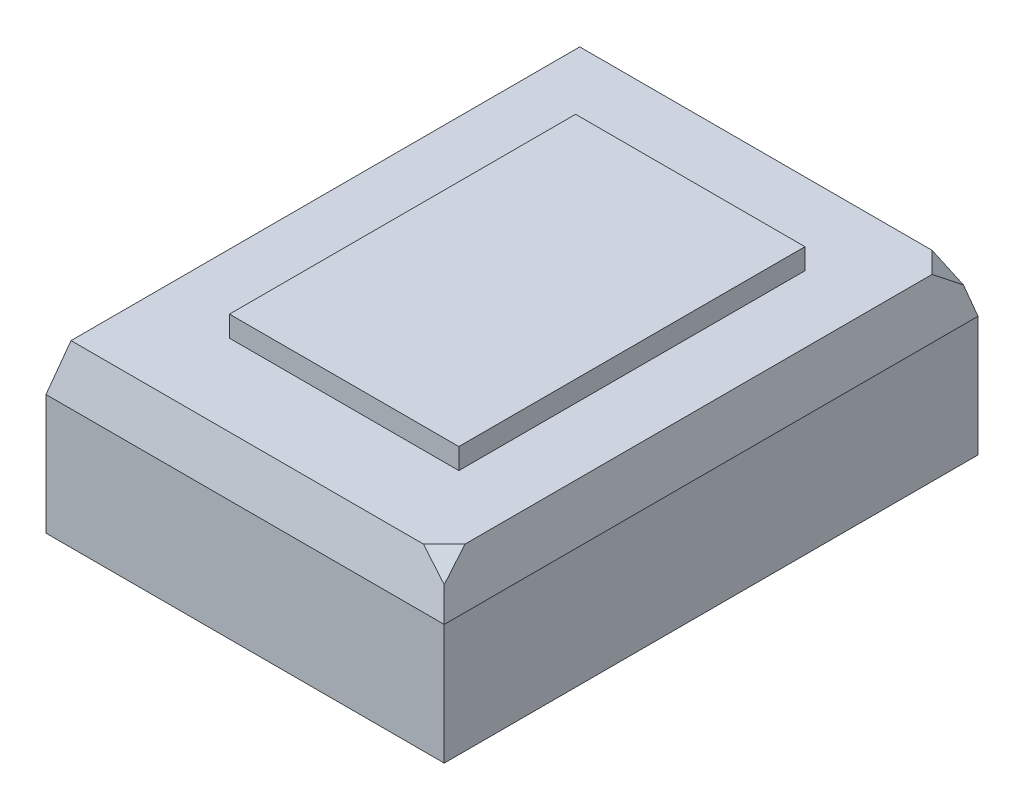
ISO-10303-21;
HEADER;
FILE_DESCRIPTION(('STEP AP214'),'2;1');
FILE_NAME('part.step','',(''),(''),'','','');
FILE_SCHEMA(('AUTOMOTIVE_DESIGN { 1 0 10303 214 1 1 1 1 }'));
ENDSEC;
DATA;
#1=APPLICATION_CONTEXT('core data for automotive mechanical design processes');
#2=APPLICATION_PROTOCOL_DEFINITION('international standard','automotive_design',2000,#1);
#3=PRODUCT_CONTEXT('',#1,'mechanical');
#4=PRODUCT('Part','Part','',(#3));
#5=PRODUCT_RELATED_PRODUCT_CATEGORY('part','',(#4));
#6=PRODUCT_DEFINITION_FORMATION('','',#4);
#7=PRODUCT_DEFINITION_CONTEXT('part definition',#1,'design');
#8=PRODUCT_DEFINITION('design','',#6,#7);
#9=PRODUCT_DEFINITION_SHAPE('','',#8);
#10=(LENGTH_UNIT() NAMED_UNIT(*) SI_UNIT(.MILLI.,.METRE.));
#11=(NAMED_UNIT(*) PLANE_ANGLE_UNIT() SI_UNIT($,.RADIAN.));
#12=(NAMED_UNIT(*) SI_UNIT($,.STERADIAN.) SOLID_ANGLE_UNIT());
#13=UNCERTAINTY_MEASURE_WITH_UNIT(LENGTH_MEASURE(1.E-05),#10,'distance_accuracy_value','');
#14=(GEOMETRIC_REPRESENTATION_CONTEXT(3) GLOBAL_UNCERTAINTY_ASSIGNED_CONTEXT((#13)) GLOBAL_UNIT_ASSIGNED_CONTEXT((#10,
#11,#12)) REPRESENTATION_CONTEXT('',''));
#15=CARTESIAN_POINT('',(0.,0.,0.));
#16=DIRECTION('',(0.,0.,1.));
#17=DIRECTION('',(1.,0.,0.));
#18=AXIS2_PLACEMENT_3D('',#15,#16,#17);
#19=CARTESIAN_POINT('',(47.75,28.8038475772934,0.));
#20=DIRECTION('',(-0.965925826289068,-0.258819045102523,0.));
#21=DIRECTION('',(0.,0.,1.));
#22=AXIS2_PLACEMENT_3D('',#19,#20,#21);
#23=PLANE('',#22);
#24=DIRECTION('',(0.158434170327627,-0.591284373317722,0.790747370240879));
#25=VECTOR('',#24,1.);
#26=CARTESIAN_POINT('',(38.8583971909708,61.9877610213121,26.5949201607857));
#27=LINE('',#26,#25);
#28=CARTESIAN_POINT('',(46.0028140354287,35.3244343673448,62.2528140354287));
#29=VERTEX_POINT('',#28);
#30=CARTESIAN_POINT('',(44.75,40.,56.));
#31=VERTEX_POINT('',#30);
#32=EDGE_CURVE('E144',#29,#31,#27,.F.);
#33=ORIENTED_EDGE('',*,*,#32,.F.);
#34=DIRECTION('',(-0.250562807085733,0.935113126531028,-0.250562807085733));
#35=VECTOR('',#34,1.);
#36=CARTESIAN_POINT('',(43.7319699011403,43.7993400525786,59.9819699011403));
#37=LINE('',#36,#35);
#38=CARTESIAN_POINT('',(47.75,28.8038475772934,64.));
#39=VERTEX_POINT('',#38);
#40=EDGE_CURVE('E134',#39,#29,#37,.T.);
#41=ORIENTED_EDGE('',*,*,#40,.F.);
#42=DIRECTION('',(0.,0.,1.));
#43=VECTOR('',#42,1.);
#44=CARTESIAN_POINT('',(47.75,28.8038475772934,0.));
#45=LINE('',#44,#43);
#46=CARTESIAN_POINT('',(47.75,28.8038475772934,-64.));
#47=VERTEX_POINT('',#46);
#48=EDGE_CURVE('E169',#47,#39,#45,.T.);
#49=ORIENTED_EDGE('',*,*,#48,.F.);
#50=DIRECTION('',(0.250562807085733,-0.935113126531028,-0.250562807085733));
#51=VECTOR('',#50,1.);
#52=CARTESIAN_POINT('',(44.7521728559289,39.9918907912757,-61.0021728559289));
#53=LINE('',#52,#51);
#54=CARTESIAN_POINT('',(46.0028140354286,35.3244343673449,-62.2528140354286));
#55=VERTEX_POINT('',#54);
#56=EDGE_CURVE('E164',#47,#55,#53,.F.);
#57=ORIENTED_EDGE('',*,*,#56,.T.);
#58=DIRECTION('',(0.158434170327627,-0.591284373317722,-0.790747370240879));
#59=VECTOR('',#58,1.);
#60=CARTESIAN_POINT('',(38.8583971909708,61.9877610213121,-26.5949201607857));
#61=LINE('',#60,#59);
#62=CARTESIAN_POINT('',(44.75,40.,-56.));
#63=VERTEX_POINT('',#62);
#64=EDGE_CURVE('E148',#55,#63,#61,.F.);
#65=ORIENTED_EDGE('',*,*,#64,.T.);
#66=DIRECTION('',(0.,0.,-1.));
#67=VECTOR('',#66,1.);
#68=CARTESIAN_POINT('',(44.75,40.,0.));
#69=LINE('',#68,#67);
#70=EDGE_CURVE('E146',#31,#63,#69,.T.);
#71=ORIENTED_EDGE('',*,*,#70,.F.);
#72=EDGE_LOOP('',(#33,#41,#49,#57,#65,#71));
#73=FACE_BOUND('',#72,.T.);
#74=ADVANCED_FACE('F47',(#73),#23,.F.);
#75=CARTESIAN_POINT('',(0.,28.8038475772934,-64.));
#76=DIRECTION('',(0.,-0.258819045102523,0.965925826289068));
#77=DIRECTION('',(1.,0.,0.));
#78=AXIS2_PLACEMENT_3D('',#75,#76,#77);
#79=PLANE('',#78);
#80=DIRECTION('',(-1.,0.,0.));
#81=VECTOR('',#80,1.);
#82=CARTESIAN_POINT('',(0.,40.,-61.));
#83=LINE('',#82,#81);
#84=CARTESIAN_POINT('',(39.75,40.,-61.));
#85=VERTEX_POINT('',#84);
#86=CARTESIAN_POINT('',(-44.75,40.,-61.));
#87=VERTEX_POINT('',#86);
#88=EDGE_CURVE('E179',#85,#87,#83,.T.);
#89=ORIENTED_EDGE('',*,*,#88,.F.);
#90=DIRECTION('',(-0.790747370240879,0.591284373317722,0.158434170327627));
#91=VECTOR('',#90,1.);
#92=CARTESIAN_POINT('',(20.5057429683572,54.3899668682474,-57.1442199985424));
#93=LINE('',#92,#91);
#94=EDGE_CURVE('E153',#85,#55,#93,.F.);
#95=ORIENTED_EDGE('',*,*,#94,.T.);
#96=ORIENTED_EDGE('',*,*,#56,.F.);
#97=DIRECTION('',(1.,0.,0.));
#98=VECTOR('',#97,1.);
#99=CARTESIAN_POINT('',(0.,28.8038475772934,-64.));
#100=LINE('',#99,#98);
#101=CARTESIAN_POINT('',(-47.75,28.8038475772934,-64.));
#102=VERTEX_POINT('',#101);
#103=EDGE_CURVE('E159',#102,#47,#100,.T.);
#104=ORIENTED_EDGE('',*,*,#103,.F.);
#105=DIRECTION('',(-0.250562807085733,-0.935113126531028,-0.250562807085733));
#106=VECTOR('',#105,1.);
#107=CARTESIAN_POINT('',(-44.7521728559289,39.9918907912757,-61.0021728559289));
#108=LINE('',#107,#106);
#109=EDGE_CURVE('E160',#87,#102,#108,.T.);
#110=ORIENTED_EDGE('',*,*,#109,.F.);
#111=EDGE_LOOP('',(#89,#95,#96,#104,#110));
#112=FACE_BOUND('',#111,.T.);
#113=ADVANCED_FACE('F50',(#112),#79,.F.);
#114=CARTESIAN_POINT('',(0.,40.,0.));
#115=DIRECTION('',(0.,1.,0.));
#116=DIRECTION('',(0.,0.,1.));
#117=AXIS2_PLACEMENT_3D('',#114,#115,#116);
#118=PLANE('',#117);
#119=DIRECTION('',(-0.707106781186548,0.,0.707106781186548));
#120=VECTOR('',#119,1.);
#121=CARTESIAN_POINT('',(50.375,40.,50.375));
#122=LINE('',#121,#120);
#123=CARTESIAN_POINT('',(39.75,40.,61.));
#124=VERTEX_POINT('',#123);
#125=EDGE_CURVE('E56',#31,#124,#122,.T.);
#126=ORIENTED_EDGE('',*,*,#125,.F.);
#127=ORIENTED_EDGE('',*,*,#70,.T.);
#128=DIRECTION('',(-0.707106781186548,0.,-0.707106781186548));
#129=VECTOR('',#128,1.);
#130=CARTESIAN_POINT('',(50.375,40.,-50.375));
#131=LINE('',#130,#129);
#132=EDGE_CURVE('E156',#63,#85,#131,.T.);
#133=ORIENTED_EDGE('',*,*,#132,.T.);
#134=ORIENTED_EDGE('',*,*,#88,.T.);
#135=DIRECTION('',(0.,0.,1.));
#136=VECTOR('',#135,1.);
#137=CARTESIAN_POINT('',(-44.75,40.,64.));
#138=LINE('',#137,#136);
#139=CARTESIAN_POINT('',(-44.75,40.,61.));
#140=VERTEX_POINT('',#139);
#141=EDGE_CURVE('E176',#87,#140,#138,.T.);
#142=ORIENTED_EDGE('',*,*,#141,.T.);
#143=DIRECTION('',(1.,0.,0.));
#144=VECTOR('',#143,1.);
#145=CARTESIAN_POINT('',(47.75,40.,61.));
#146=LINE('',#145,#144);
#147=EDGE_CURVE('E174',#140,#124,#146,.T.);
#148=ORIENTED_EDGE('',*,*,#147,.T.);
#149=EDGE_LOOP('',(#126,#127,#133,#134,#142,#148));
#150=FACE_BOUND('',#149,.T.);
#151=DIRECTION('',(0.,0.,-1.));
#152=VECTOR('',#151,1.);
#153=CARTESIAN_POINT('',(28.75,40.,0.));
#154=LINE('',#153,#152);
#155=CARTESIAN_POINT('',(28.75,40.,41.5));
#156=VERTEX_POINT('',#155);
#157=CARTESIAN_POINT('',(28.75,40.,-41.5));
#158=VERTEX_POINT('',#157);
#159=EDGE_CURVE('E214',#156,#158,#154,.T.);
#160=ORIENTED_EDGE('',*,*,#159,.F.);
#161=DIRECTION('',(-1.,0.,0.));
#162=VECTOR('',#161,1.);
#163=CARTESIAN_POINT('',(0.,40.,41.5));
#164=LINE('',#163,#162);
#165=CARTESIAN_POINT('',(-26.25,40.,41.5));
#166=VERTEX_POINT('',#165);
#167=EDGE_CURVE('E163',#156,#166,#164,.T.);
#168=ORIENTED_EDGE('',*,*,#167,.T.);
#169=DIRECTION('',(0.,0.,-1.));
#170=VECTOR('',#169,1.);
#171=CARTESIAN_POINT('',(-26.25,40.,0.));
#172=LINE('',#171,#170);
#173=CARTESIAN_POINT('',(-26.25,40.,-41.5));
#174=VERTEX_POINT('',#173);
#175=EDGE_CURVE('E221',#166,#174,#172,.T.);
#176=ORIENTED_EDGE('',*,*,#175,.T.);
#177=DIRECTION('',(-1.,0.,0.));
#178=VECTOR('',#177,1.);
#179=CARTESIAN_POINT('',(0.,40.,-41.5));
#180=LINE('',#179,#178);
#181=EDGE_CURVE('E218',#158,#174,#180,.T.);
#182=ORIENTED_EDGE('',*,*,#181,.F.);
#183=EDGE_LOOP('',(#160,#168,#176,#182));
#184=FACE_BOUND('',#183,.T.);
#185=ADVANCED_FACE('F246',(#150,#184),#118,.T.);
#186=CARTESIAN_POINT('',(47.75,40.,0.));
#187=DIRECTION('',(1.,0.,0.));
#188=DIRECTION('',(0.,0.,-1.));
#189=AXIS2_PLACEMENT_3D('',#186,#187,#188);
#190=PLANE('',#189);
#191=DIRECTION('',(0.,-1.,0.));
#192=VECTOR('',#191,1.);
#193=CARTESIAN_POINT('',(47.75,40.,-64.));
#194=LINE('',#193,#192);
#195=CARTESIAN_POINT('',(47.75,0.,-64.));
#196=VERTEX_POINT('',#195);
#197=EDGE_CURVE('E181',#47,#196,#194,.T.);
#198=ORIENTED_EDGE('',*,*,#197,.F.);
#199=ORIENTED_EDGE('',*,*,#48,.T.);
#200=DIRECTION('',(0.,-1.,0.));
#201=VECTOR('',#200,1.);
#202=CARTESIAN_POINT('',(47.75,40.,64.));
#203=LINE('',#202,#201);
#204=CARTESIAN_POINT('',(47.75,0.,64.));
#205=VERTEX_POINT('',#204);
#206=EDGE_CURVE('E187',#39,#205,#203,.T.);
#207=ORIENTED_EDGE('',*,*,#206,.T.);
#208=DIRECTION('',(0.,0.,1.));
#209=VECTOR('',#208,1.);
#210=CARTESIAN_POINT('',(47.75,0.,0.));
#211=LINE('',#210,#209);
#212=EDGE_CURVE('E198',#196,#205,#211,.T.);
#213=ORIENTED_EDGE('',*,*,#212,.F.);
#214=EDGE_LOOP('',(#198,#199,#207,#213));
#215=FACE_BOUND('',#214,.T.);
#216=ADVANCED_FACE('F300',(#215),#190,.T.);
#217=CARTESIAN_POINT('',(0.,40.,-64.));
#218=DIRECTION('',(0.,0.,-1.));
#219=DIRECTION('',(-1.,0.,0.));
#220=AXIS2_PLACEMENT_3D('',#217,#218,#219);
#221=PLANE('',#220);
#222=DIRECTION('',(0.,-1.,0.));
#223=VECTOR('',#222,1.);
#224=CARTESIAN_POINT('',(-47.75,40.,-64.));
#225=LINE('',#224,#223);
#226=CARTESIAN_POINT('',(-47.75,0.,-64.));
#227=VERTEX_POINT('',#226);
#228=EDGE_CURVE('E183',#102,#227,#225,.T.);
#229=ORIENTED_EDGE('',*,*,#228,.F.);
#230=ORIENTED_EDGE('',*,*,#103,.T.);
#231=ORIENTED_EDGE('',*,*,#197,.T.);
#232=DIRECTION('',(1.,0.,0.));
#233=VECTOR('',#232,1.);
#234=CARTESIAN_POINT('',(0.,0.,-64.));
#235=LINE('',#234,#233);
#236=EDGE_CURVE('E195',#227,#196,#235,.T.);
#237=ORIENTED_EDGE('',*,*,#236,.F.);
#238=EDGE_LOOP('',(#229,#230,#231,#237));
#239=FACE_BOUND('',#238,.T.);
#240=ADVANCED_FACE('F296',(#239),#221,.T.);
#241=CARTESIAN_POINT('',(-47.75,40.,0.));
#242=DIRECTION('',(1.,0.,0.));
#243=DIRECTION('',(0.,0.,-1.));
#244=AXIS2_PLACEMENT_3D('',#241,#242,#243);
#245=PLANE('',#244);
#246=DIRECTION('',(0.,-1.,0.));
#247=VECTOR('',#246,1.);
#248=CARTESIAN_POINT('',(-47.75,40.,64.));
#249=LINE('',#248,#247);
#250=CARTESIAN_POINT('',(-47.75,28.8038475772934,64.));
#251=VERTEX_POINT('',#250);
#252=CARTESIAN_POINT('',(-47.75,0.,64.));
#253=VERTEX_POINT('',#252);
#254=EDGE_CURVE('E185',#251,#253,#249,.T.);
#255=ORIENTED_EDGE('',*,*,#254,.F.);
#256=DIRECTION('',(0.,0.,-1.));
#257=VECTOR('',#256,1.);
#258=CARTESIAN_POINT('',(-47.75,28.8038475772934,-64.));
#259=LINE('',#258,#257);
#260=EDGE_CURVE('E171',#251,#102,#259,.T.);
#261=ORIENTED_EDGE('',*,*,#260,.T.);
#262=ORIENTED_EDGE('',*,*,#228,.T.);
#263=DIRECTION('',(0.,0.,1.));
#264=VECTOR('',#263,1.);
#265=CARTESIAN_POINT('',(-47.75,0.,0.));
#266=LINE('',#265,#264);
#267=EDGE_CURVE('E192',#227,#253,#266,.T.);
#268=ORIENTED_EDGE('',*,*,#267,.T.);
#269=EDGE_LOOP('',(#255,#261,#262,#268));
#270=FACE_BOUND('',#269,.T.);
#271=ADVANCED_FACE('F308',(#270),#245,.F.);
#272=CARTESIAN_POINT('',(0.,40.,64.));
#273=DIRECTION('',(0.,0.,-1.));
#274=DIRECTION('',(-1.,0.,0.));
#275=AXIS2_PLACEMENT_3D('',#272,#273,#274);
#276=PLANE('',#275);
#277=ORIENTED_EDGE('',*,*,#206,.F.);
#278=DIRECTION('',(-1.,0.,0.));
#279=VECTOR('',#278,1.);
#280=CARTESIAN_POINT('',(-47.75,28.8038475772934,64.));
#281=LINE('',#280,#279);
#282=EDGE_CURVE('E138',#39,#251,#281,.T.);
#283=ORIENTED_EDGE('',*,*,#282,.T.);
#284=ORIENTED_EDGE('',*,*,#254,.T.);
#285=DIRECTION('',(1.,0.,0.));
#286=VECTOR('',#285,1.);
#287=CARTESIAN_POINT('',(0.,0.,64.));
#288=LINE('',#287,#286);
#289=EDGE_CURVE('E189',#253,#205,#288,.T.);
#290=ORIENTED_EDGE('',*,*,#289,.T.);
#291=EDGE_LOOP('',(#277,#283,#284,#290));
#292=FACE_BOUND('',#291,.T.);
#293=ADVANCED_FACE('F310',(#292),#276,.F.);
#294=CARTESIAN_POINT('',(0.,0.,0.));
#295=DIRECTION('',(0.,1.,0.));
#296=DIRECTION('',(0.,0.,1.));
#297=AXIS2_PLACEMENT_3D('',#294,#295,#296);
#298=PLANE('',#297);
#299=ORIENTED_EDGE('',*,*,#212,.T.);
#300=ORIENTED_EDGE('',*,*,#289,.F.);
#301=ORIENTED_EDGE('',*,*,#267,.F.);
#302=ORIENTED_EDGE('',*,*,#236,.T.);
#303=EDGE_LOOP('',(#299,#300,#301,#302));
#304=FACE_BOUND('',#303,.T.);
#305=ADVANCED_FACE('F305',(#304),#298,.F.);
#306=CARTESIAN_POINT('',(0.,45.,41.5));
#307=DIRECTION('',(0.,0.,1.));
#308=DIRECTION('',(1.,0.,0.));
#309=AXIS2_PLACEMENT_3D('',#306,#307,#308);
#310=PLANE('',#309);
#311=ORIENTED_EDGE('',*,*,#167,.F.);
#312=DIRECTION('',(0.,-1.,0.));
#313=VECTOR('',#312,1.);
#314=CARTESIAN_POINT('',(28.75,45.,41.5));
#315=LINE('',#314,#313);
#316=CARTESIAN_POINT('',(28.75,45.,41.5));
#317=VERTEX_POINT('',#316);
#318=EDGE_CURVE('E201',#317,#156,#315,.T.);
#319=ORIENTED_EDGE('',*,*,#318,.F.);
#320=DIRECTION('',(-1.,0.,0.));
#321=VECTOR('',#320,1.);
#322=CARTESIAN_POINT('',(0.,45.,41.5));
#323=LINE('',#322,#321);
#324=CARTESIAN_POINT('',(-26.25,45.,41.5));
#325=VERTEX_POINT('',#324);
#326=EDGE_CURVE('E217',#317,#325,#323,.T.);
#327=ORIENTED_EDGE('',*,*,#326,.T.);
#328=DIRECTION('',(0.,-1.,0.));
#329=VECTOR('',#328,1.);
#330=CARTESIAN_POINT('',(-26.25,45.,41.5));
#331=LINE('',#330,#329);
#332=EDGE_CURVE('E202',#325,#166,#331,.T.);
#333=ORIENTED_EDGE('',*,*,#332,.T.);
#334=EDGE_LOOP('',(#311,#319,#327,#333));
#335=FACE_BOUND('',#334,.T.);
#336=ADVANCED_FACE('F234',(#335),#310,.T.);
#337=CARTESIAN_POINT('',(28.75,45.,0.));
#338=DIRECTION('',(-1.,0.,0.));
#339=DIRECTION('',(0.,0.,1.));
#340=AXIS2_PLACEMENT_3D('',#337,#338,#339);
#341=PLANE('',#340);
#342=ORIENTED_EDGE('',*,*,#159,.T.);
#343=DIRECTION('',(0.,-1.,0.));
#344=VECTOR('',#343,1.);
#345=CARTESIAN_POINT('',(28.75,45.,-41.5));
#346=LINE('',#345,#344);
#347=CARTESIAN_POINT('',(28.75,45.,-41.5));
#348=VERTEX_POINT('',#347);
#349=EDGE_CURVE('E209',#348,#158,#346,.T.);
#350=ORIENTED_EDGE('',*,*,#349,.F.);
#351=DIRECTION('',(0.,0.,-1.));
#352=VECTOR('',#351,1.);
#353=CARTESIAN_POINT('',(28.75,45.,0.));
#354=LINE('',#353,#352);
#355=EDGE_CURVE('E206',#317,#348,#354,.T.);
#356=ORIENTED_EDGE('',*,*,#355,.F.);
#357=ORIENTED_EDGE('',*,*,#318,.T.);
#358=EDGE_LOOP('',(#342,#350,#356,#357));
#359=FACE_BOUND('',#358,.T.);
#360=ADVANCED_FACE('F248',(#359),#341,.F.);
#361=CARTESIAN_POINT('',(0.,45.,-41.5));
#362=DIRECTION('',(0.,0.,1.));
#363=DIRECTION('',(1.,0.,0.));
#364=AXIS2_PLACEMENT_3D('',#361,#362,#363);
#365=PLANE('',#364);
#366=ORIENTED_EDGE('',*,*,#181,.T.);
#367=DIRECTION('',(0.,-1.,0.));
#368=VECTOR('',#367,1.);
#369=CARTESIAN_POINT('',(-26.25,45.,-41.5));
#370=LINE('',#369,#368);
#371=CARTESIAN_POINT('',(-26.25,45.,-41.5));
#372=VERTEX_POINT('',#371);
#373=EDGE_CURVE('E205',#372,#174,#370,.T.);
#374=ORIENTED_EDGE('',*,*,#373,.F.);
#375=DIRECTION('',(-1.,0.,0.));
#376=VECTOR('',#375,1.);
#377=CARTESIAN_POINT('',(0.,45.,-41.5));
#378=LINE('',#377,#376);
#379=EDGE_CURVE('E225',#348,#372,#378,.T.);
#380=ORIENTED_EDGE('',*,*,#379,.F.);
#381=ORIENTED_EDGE('',*,*,#349,.T.);
#382=EDGE_LOOP('',(#366,#374,#380,#381));
#383=FACE_BOUND('',#382,.T.);
#384=ADVANCED_FACE('F250',(#383),#365,.F.);
#385=CARTESIAN_POINT('',(-26.25,45.,0.));
#386=DIRECTION('',(-1.,0.,0.));
#387=DIRECTION('',(0.,0.,1.));
#388=AXIS2_PLACEMENT_3D('',#385,#386,#387);
#389=PLANE('',#388);
#390=ORIENTED_EDGE('',*,*,#175,.F.);
#391=ORIENTED_EDGE('',*,*,#332,.F.);
#392=DIRECTION('',(0.,0.,-1.));
#393=VECTOR('',#392,1.);
#394=CARTESIAN_POINT('',(-26.25,45.,0.));
#395=LINE('',#394,#393);
#396=EDGE_CURVE('E227',#325,#372,#395,.T.);
#397=ORIENTED_EDGE('',*,*,#396,.T.);
#398=ORIENTED_EDGE('',*,*,#373,.T.);
#399=EDGE_LOOP('',(#390,#391,#397,#398));
#400=FACE_BOUND('',#399,.T.);
#401=ADVANCED_FACE('F244',(#400),#389,.T.);
#402=CARTESIAN_POINT('',(0.,45.,0.));
#403=DIRECTION('',(0.,-1.,0.));
#404=DIRECTION('',(0.,0.,-1.));
#405=AXIS2_PLACEMENT_3D('',#402,#403,#404);
#406=PLANE('',#405);
#407=ORIENTED_EDGE('',*,*,#326,.F.);
#408=ORIENTED_EDGE('',*,*,#355,.T.);
#409=ORIENTED_EDGE('',*,*,#379,.T.);
#410=ORIENTED_EDGE('',*,*,#396,.F.);
#411=EDGE_LOOP('',(#407,#408,#409,#410));
#412=FACE_BOUND('',#411,.T.);
#413=ADVANCED_FACE('F239',(#412),#406,.F.);
#414=CARTESIAN_POINT('',(-44.75,40.,0.));
#415=DIRECTION('',(-0.965925826289068,0.258819045102523,0.));
#416=DIRECTION('',(0.,0.,-1.));
#417=AXIS2_PLACEMENT_3D('',#414,#415,#416);
#418=PLANE('',#417);
#419=ORIENTED_EDGE('',*,*,#109,.T.);
#420=ORIENTED_EDGE('',*,*,#260,.F.);
#421=DIRECTION('',(0.250562807085733,0.935113126531028,-0.250562807085733));
#422=VECTOR('',#421,1.);
#423=CARTESIAN_POINT('',(-40.9203150620244,54.2925787655062,57.1703150620244));
#424=LINE('',#423,#422);
#425=EDGE_CURVE('E141',#140,#251,#424,.F.);
#426=ORIENTED_EDGE('',*,*,#425,.F.);
#427=ORIENTED_EDGE('',*,*,#141,.F.);
#428=EDGE_LOOP('',(#419,#420,#426,#427));
#429=FACE_BOUND('',#428,.T.);
#430=ADVANCED_FACE('F274',(#429),#418,.T.);
#431=CARTESIAN_POINT('',(0.,40.,61.));
#432=DIRECTION('',(0.,0.258819045102523,0.965925826289068));
#433=DIRECTION('',(-1.,0.,0.));
#434=AXIS2_PLACEMENT_3D('',#431,#432,#433);
#435=PLANE('',#434);
#436=DIRECTION('',(0.790747370240879,-0.591284373317722,0.158434170327627));
#437=VECTOR('',#436,1.);
#438=CARTESIAN_POINT('',(14.8950642091711,58.5853733898042,56.0200642091711));
#439=LINE('',#438,#437);
#440=EDGE_CURVE('E11',#124,#29,#439,.T.);
#441=ORIENTED_EDGE('',*,*,#440,.F.);
#442=ORIENTED_EDGE('',*,*,#147,.F.);
#443=ORIENTED_EDGE('',*,*,#425,.T.);
#444=ORIENTED_EDGE('',*,*,#282,.F.);
#445=ORIENTED_EDGE('',*,*,#40,.T.);
#446=EDGE_LOOP('',(#441,#442,#443,#444,#445));
#447=FACE_BOUND('',#446,.T.);
#448=ADVANCED_FACE('F136',(#447),#435,.T.);
#449=CARTESIAN_POINT('',(36.0418089185503,57.8574730839415,-36.0418089185503));
#450=DIRECTION('',(0.467425046703358,0.750351685164181,-0.467425046703358));
#451=DIRECTION('',(0.,0.528741802650872,0.848782720211425));
#452=AXIS2_PLACEMENT_3D('',#449,#450,#451);
#453=PLANE('',#452);
#454=ORIENTED_EDGE('',*,*,#132,.F.);
#455=ORIENTED_EDGE('',*,*,#64,.F.);
#456=ORIENTED_EDGE('',*,*,#94,.F.);
#457=EDGE_LOOP('',(#454,#455,#456));
#458=FACE_BOUND('',#457,.T.);
#459=ADVANCED_FACE('F283',(#458),#453,.T.);
#460=CARTESIAN_POINT('',(36.0418089185503,57.8574730839415,36.0418089185503));
#461=DIRECTION('',(-0.467425046703358,-0.750351685164181,-0.467425046703358));
#462=DIRECTION('',(0.,0.528741802650872,-0.848782720211425));
#463=AXIS2_PLACEMENT_3D('',#460,#461,#462);
#464=PLANE('',#463);
#465=ORIENTED_EDGE('',*,*,#440,.T.);
#466=ORIENTED_EDGE('',*,*,#32,.T.);
#467=ORIENTED_EDGE('',*,*,#125,.T.);
#468=EDGE_LOOP('',(#465,#466,#467));
#469=FACE_BOUND('',#468,.T.);
#470=ADVANCED_FACE('F150',(#469),#464,.F.);
#471=CLOSED_SHELL('',(#74,#113,#185,#216,#240,#271,#293,#305,#336,#360,#384,#401,#413,#430,#448,
#459,#470));
#472=MANIFOLD_SOLID_BREP('B2',#471);
#473=ADVANCED_BREP_SHAPE_REPRESENTATION('',(#18,#472),#14);
#474=SHAPE_DEFINITION_REPRESENTATION(#9,#473);
ENDSEC;
END-ISO-10303-21;
